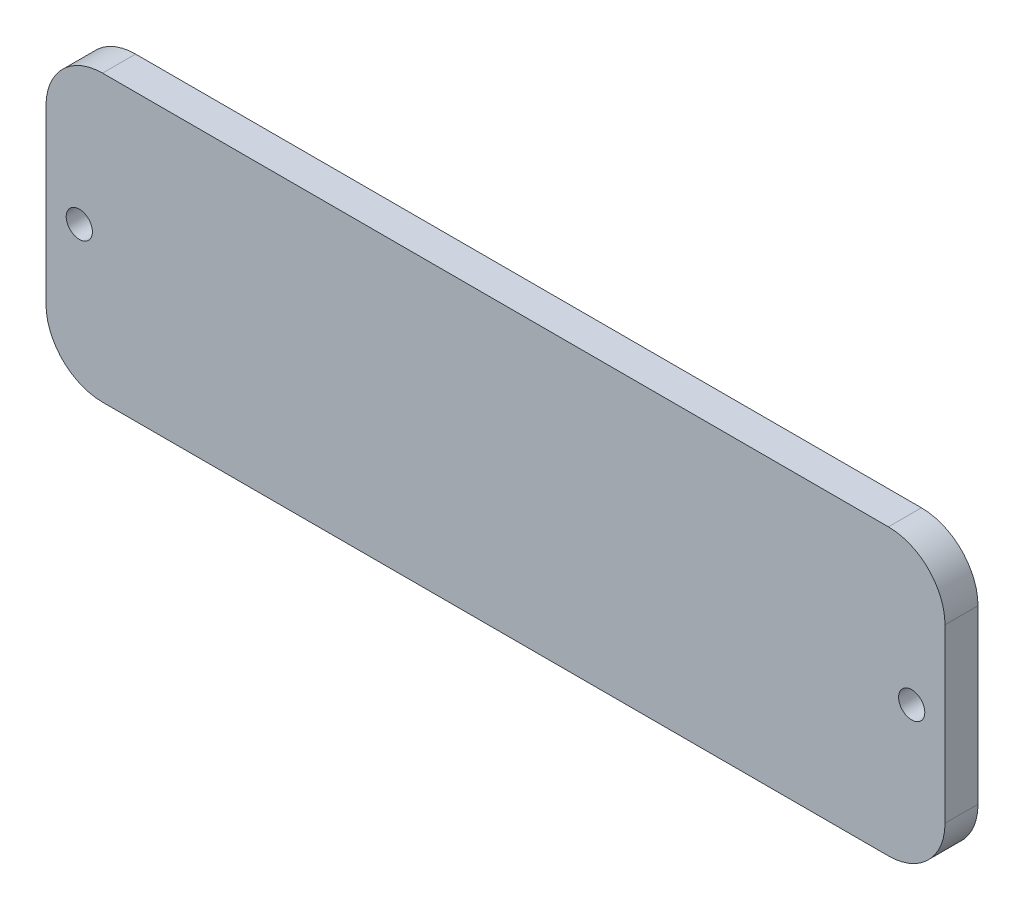
ISO-10303-21;
HEADER;
FILE_DESCRIPTION(('STEP AP214'),'2;1');
FILE_NAME('part.step','',(''),(''),'','','');
FILE_SCHEMA(('AUTOMOTIVE_DESIGN { 1 0 10303 214 1 1 1 1 }'));
ENDSEC;
DATA;
#1=APPLICATION_CONTEXT('core data for automotive mechanical design processes');
#2=APPLICATION_PROTOCOL_DEFINITION('international standard','automotive_design',2000,#1);
#3=PRODUCT_CONTEXT('',#1,'mechanical');
#4=PRODUCT('Part','Part','',(#3));
#5=PRODUCT_RELATED_PRODUCT_CATEGORY('part','',(#4));
#6=PRODUCT_DEFINITION_FORMATION('','',#4);
#7=PRODUCT_DEFINITION_CONTEXT('part definition',#1,'design');
#8=PRODUCT_DEFINITION('design','',#6,#7);
#9=PRODUCT_DEFINITION_SHAPE('','',#8);
#10=(LENGTH_UNIT() NAMED_UNIT(*) SI_UNIT(.MILLI.,.METRE.));
#11=(NAMED_UNIT(*) PLANE_ANGLE_UNIT() SI_UNIT($,.RADIAN.));
#12=(NAMED_UNIT(*) SI_UNIT($,.STERADIAN.) SOLID_ANGLE_UNIT());
#13=UNCERTAINTY_MEASURE_WITH_UNIT(LENGTH_MEASURE(1.E-05),#10,'distance_accuracy_value','');
#14=(GEOMETRIC_REPRESENTATION_CONTEXT(3) GLOBAL_UNCERTAINTY_ASSIGNED_CONTEXT((#13)) GLOBAL_UNIT_ASSIGNED_CONTEXT((#10,
#11,#12)) REPRESENTATION_CONTEXT('',''));
#15=CARTESIAN_POINT('',(0.,0.,0.));
#16=DIRECTION('',(0.,0.,1.));
#17=DIRECTION('',(1.,0.,0.));
#18=AXIS2_PLACEMENT_3D('',#15,#16,#17);
#19=CARTESIAN_POINT('',(-23.8125,5.207,-47.2125));
#20=DIRECTION('',(0.,0.,-1.));
#21=DIRECTION('',(-1.,0.,0.));
#22=AXIS2_PLACEMENT_3D('',#19,#20,#21);
#23=CYLINDRICAL_SURFACE('',#22,3.429);
#24=CARTESIAN_POINT('',(-23.8125,5.207,-49.2125));
#25=DIRECTION('',(0.,0.,-1.));
#26=DIRECTION('',(-1.,0.,0.));
#27=AXIS2_PLACEMENT_3D('',#24,#25,#26);
#28=CIRCLE('',#27,3.429);
#29=CARTESIAN_POINT('',(-27.2415,5.207,-49.2125));
#30=VERTEX_POINT('',#29);
#31=CARTESIAN_POINT('',(-23.8125,8.636,-49.2125));
#32=VERTEX_POINT('',#31);
#33=EDGE_CURVE('E129',#30,#32,#28,.T.);
#34=ORIENTED_EDGE('',*,*,#33,.F.);
#35=DIRECTION('',(0.,0.,-1.));
#36=VECTOR('',#35,1.);
#37=CARTESIAN_POINT('',(-27.2415,5.207,-47.2125));
#38=LINE('',#37,#36);
#39=CARTESIAN_POINT('',(-27.2415,5.207,-47.2125));
#40=VERTEX_POINT('',#39);
#41=EDGE_CURVE('E11',#40,#30,#38,.T.);
#42=ORIENTED_EDGE('',*,*,#41,.F.);
#43=CARTESIAN_POINT('',(-23.8125,5.207,-47.2125));
#44=DIRECTION('',(0.,0.,-1.));
#45=DIRECTION('',(-1.,0.,0.));
#46=AXIS2_PLACEMENT_3D('',#43,#44,#45);
#47=CIRCLE('',#46,3.429);
#48=CARTESIAN_POINT('',(-23.8125,8.636,-47.2125));
#49=VERTEX_POINT('',#48);
#50=EDGE_CURVE('E150',#40,#49,#47,.T.);
#51=ORIENTED_EDGE('',*,*,#50,.T.);
#52=DIRECTION('',(0.,0.,-1.));
#53=VECTOR('',#52,1.);
#54=CARTESIAN_POINT('',(-23.8125,8.636,-47.2125));
#55=LINE('',#54,#53);
#56=EDGE_CURVE('E35',#49,#32,#55,.T.);
#57=ORIENTED_EDGE('',*,*,#56,.T.);
#58=EDGE_LOOP('',(#34,#42,#51,#57));
#59=FACE_BOUND('',#58,.T.);
#60=ADVANCED_FACE('F32',(#59),#23,.T.);
#61=CARTESIAN_POINT('',(-27.2415,-5.207,-47.2125));
#62=DIRECTION('',(-1.,0.,0.));
#63=DIRECTION('',(0.,0.,1.));
#64=AXIS2_PLACEMENT_3D('',#61,#62,#63);
#65=PLANE('',#64);
#66=DIRECTION('',(0.,1.,0.));
#67=VECTOR('',#66,1.);
#68=CARTESIAN_POINT('',(-27.2415,-5.207,-49.2125));
#69=LINE('',#68,#67);
#70=CARTESIAN_POINT('',(-27.2415,-5.207,-49.2125));
#71=VERTEX_POINT('',#70);
#72=EDGE_CURVE('E148',#71,#30,#69,.T.);
#73=ORIENTED_EDGE('',*,*,#72,.F.);
#74=DIRECTION('',(0.,0.,-1.));
#75=VECTOR('',#74,1.);
#76=CARTESIAN_POINT('',(-27.2415,-5.207,-47.2125));
#77=LINE('',#76,#75);
#78=CARTESIAN_POINT('',(-27.2415,-5.207,-47.2125));
#79=VERTEX_POINT('',#78);
#80=EDGE_CURVE('E41',#79,#71,#77,.T.);
#81=ORIENTED_EDGE('',*,*,#80,.F.);
#82=DIRECTION('',(0.,1.,0.));
#83=VECTOR('',#82,1.);
#84=CARTESIAN_POINT('',(-27.2415,-5.207,-47.2125));
#85=LINE('',#84,#83);
#86=EDGE_CURVE('E119',#79,#40,#85,.T.);
#87=ORIENTED_EDGE('',*,*,#86,.T.);
#88=ORIENTED_EDGE('',*,*,#41,.T.);
#89=EDGE_LOOP('',(#73,#81,#87,#88));
#90=FACE_BOUND('',#89,.T.);
#91=ADVANCED_FACE('F162',(#90),#65,.T.);
#92=CARTESIAN_POINT('',(-23.8125,-5.207,-47.2125));
#93=DIRECTION('',(0.,0.,-1.));
#94=DIRECTION('',(-1.,0.,0.));
#95=AXIS2_PLACEMENT_3D('',#92,#93,#94);
#96=CYLINDRICAL_SURFACE('',#95,3.429);
#97=CARTESIAN_POINT('',(-23.8125,-5.207,-49.2125));
#98=DIRECTION('',(0.,0.,-1.));
#99=DIRECTION('',(-1.,0.,0.));
#100=AXIS2_PLACEMENT_3D('',#97,#98,#99);
#101=CIRCLE('',#100,3.429);
#102=CARTESIAN_POINT('',(-23.8125,-8.636,-49.2125));
#103=VERTEX_POINT('',#102);
#104=EDGE_CURVE('E106',#103,#71,#101,.T.);
#105=ORIENTED_EDGE('',*,*,#104,.F.);
#106=DIRECTION('',(0.,0.,-1.));
#107=VECTOR('',#106,1.);
#108=CARTESIAN_POINT('',(-23.8125,-8.636,-47.2125));
#109=LINE('',#108,#107);
#110=CARTESIAN_POINT('',(-23.8125,-8.636,-47.2125));
#111=VERTEX_POINT('',#110);
#112=EDGE_CURVE('E101',#111,#103,#109,.T.);
#113=ORIENTED_EDGE('',*,*,#112,.F.);
#114=CARTESIAN_POINT('',(-23.8125,-5.207,-47.2125));
#115=DIRECTION('',(0.,0.,-1.));
#116=DIRECTION('',(-1.,0.,0.));
#117=AXIS2_PLACEMENT_3D('',#114,#115,#116);
#118=CIRCLE('',#117,3.429);
#119=EDGE_CURVE('E104',#111,#79,#118,.T.);
#120=ORIENTED_EDGE('',*,*,#119,.T.);
#121=ORIENTED_EDGE('',*,*,#80,.T.);
#122=EDGE_LOOP('',(#105,#113,#120,#121));
#123=FACE_BOUND('',#122,.T.);
#124=ADVANCED_FACE('F103',(#123),#96,.T.);
#125=CARTESIAN_POINT('',(23.8125,-8.636,-47.2125));
#126=DIRECTION('',(0.,-1.,0.));
#127=DIRECTION('',(1.,0.,0.));
#128=AXIS2_PLACEMENT_3D('',#125,#126,#127);
#129=PLANE('',#128);
#130=DIRECTION('',(-1.,0.,0.));
#131=VECTOR('',#130,1.);
#132=CARTESIAN_POINT('',(23.8125,-8.636,-49.2125));
#133=LINE('',#132,#131);
#134=CARTESIAN_POINT('',(23.8125,-8.636,-49.2125));
#135=VERTEX_POINT('',#134);
#136=EDGE_CURVE('E145',#135,#103,#133,.T.);
#137=ORIENTED_EDGE('',*,*,#136,.F.);
#138=DIRECTION('',(0.,0.,-1.));
#139=VECTOR('',#138,1.);
#140=CARTESIAN_POINT('',(23.8125,-8.636,-47.2125));
#141=LINE('',#140,#139);
#142=CARTESIAN_POINT('',(23.8125,-8.636,-47.2125));
#143=VERTEX_POINT('',#142);
#144=EDGE_CURVE('E111',#143,#135,#141,.T.);
#145=ORIENTED_EDGE('',*,*,#144,.F.);
#146=DIRECTION('',(-1.,0.,0.));
#147=VECTOR('',#146,1.);
#148=CARTESIAN_POINT('',(23.8125,-8.636,-47.2125));
#149=LINE('',#148,#147);
#150=EDGE_CURVE('E117',#143,#111,#149,.T.);
#151=ORIENTED_EDGE('',*,*,#150,.T.);
#152=ORIENTED_EDGE('',*,*,#112,.T.);
#153=EDGE_LOOP('',(#137,#145,#151,#152));
#154=FACE_BOUND('',#153,.T.);
#155=ADVANCED_FACE('F121',(#154),#129,.T.);
#156=CARTESIAN_POINT('',(23.8125,-5.207,-47.2125));
#157=DIRECTION('',(0.,0.,-1.));
#158=DIRECTION('',(-1.,0.,0.));
#159=AXIS2_PLACEMENT_3D('',#156,#157,#158);
#160=CYLINDRICAL_SURFACE('',#159,3.429);
#161=CARTESIAN_POINT('',(23.8125,-5.207,-49.2125));
#162=DIRECTION('',(0.,0.,-1.));
#163=DIRECTION('',(-1.,0.,0.));
#164=AXIS2_PLACEMENT_3D('',#161,#162,#163);
#165=CIRCLE('',#164,3.429);
#166=CARTESIAN_POINT('',(27.2415,-5.207,-49.2125));
#167=VERTEX_POINT('',#166);
#168=EDGE_CURVE('E142',#167,#135,#165,.T.);
#169=ORIENTED_EDGE('',*,*,#168,.F.);
#170=DIRECTION('',(0.,0.,-1.));
#171=VECTOR('',#170,1.);
#172=CARTESIAN_POINT('',(27.2415,-5.207,-47.2125));
#173=LINE('',#172,#171);
#174=CARTESIAN_POINT('',(27.2415,-5.207,-47.2125));
#175=VERTEX_POINT('',#174);
#176=EDGE_CURVE('E154',#175,#167,#173,.T.);
#177=ORIENTED_EDGE('',*,*,#176,.F.);
#178=CARTESIAN_POINT('',(23.8125,-5.207,-47.2125));
#179=DIRECTION('',(0.,0.,-1.));
#180=DIRECTION('',(-1.,0.,0.));
#181=AXIS2_PLACEMENT_3D('',#178,#179,#180);
#182=CIRCLE('',#181,3.429);
#183=EDGE_CURVE('E122',#175,#143,#182,.T.);
#184=ORIENTED_EDGE('',*,*,#183,.T.);
#185=ORIENTED_EDGE('',*,*,#144,.T.);
#186=EDGE_LOOP('',(#169,#177,#184,#185));
#187=FACE_BOUND('',#186,.T.);
#188=ADVANCED_FACE('F175',(#187),#160,.T.);
#189=CARTESIAN_POINT('',(27.2415,5.207,-47.2125));
#190=DIRECTION('',(1.,0.,0.));
#191=DIRECTION('',(0.,0.,-1.));
#192=AXIS2_PLACEMENT_3D('',#189,#190,#191);
#193=PLANE('',#192);
#194=DIRECTION('',(0.,-1.,0.));
#195=VECTOR('',#194,1.);
#196=CARTESIAN_POINT('',(27.2415,5.207,-49.2125));
#197=LINE('',#196,#195);
#198=CARTESIAN_POINT('',(27.2415,5.207,-49.2125));
#199=VERTEX_POINT('',#198);
#200=EDGE_CURVE('E139',#199,#167,#197,.T.);
#201=ORIENTED_EDGE('',*,*,#200,.F.);
#202=DIRECTION('',(0.,0.,-1.));
#203=VECTOR('',#202,1.);
#204=CARTESIAN_POINT('',(27.2415,5.207,-47.2125));
#205=LINE('',#204,#203);
#206=CARTESIAN_POINT('',(27.2415,5.207,-47.2125));
#207=VERTEX_POINT('',#206);
#208=EDGE_CURVE('E156',#207,#199,#205,.T.);
#209=ORIENTED_EDGE('',*,*,#208,.F.);
#210=DIRECTION('',(0.,-1.,0.));
#211=VECTOR('',#210,1.);
#212=CARTESIAN_POINT('',(27.2415,5.207,-47.2125));
#213=LINE('',#212,#211);
#214=EDGE_CURVE('E124',#207,#175,#213,.T.);
#215=ORIENTED_EDGE('',*,*,#214,.T.);
#216=ORIENTED_EDGE('',*,*,#176,.T.);
#217=EDGE_LOOP('',(#201,#209,#215,#216));
#218=FACE_BOUND('',#217,.T.);
#219=ADVANCED_FACE('F178',(#218),#193,.T.);
#220=CARTESIAN_POINT('',(23.8125,5.207,-47.2125));
#221=DIRECTION('',(0.,0.,-1.));
#222=DIRECTION('',(-1.,0.,0.));
#223=AXIS2_PLACEMENT_3D('',#220,#221,#222);
#224=CYLINDRICAL_SURFACE('',#223,3.429);
#225=CARTESIAN_POINT('',(23.8125,5.207,-49.2125));
#226=DIRECTION('',(0.,0.,-1.));
#227=DIRECTION('',(-1.,0.,0.));
#228=AXIS2_PLACEMENT_3D('',#225,#226,#227);
#229=CIRCLE('',#228,3.429);
#230=CARTESIAN_POINT('',(23.8125,8.636,-49.2125));
#231=VERTEX_POINT('',#230);
#232=EDGE_CURVE('E136',#231,#199,#229,.T.);
#233=ORIENTED_EDGE('',*,*,#232,.F.);
#234=DIRECTION('',(0.,0.,-1.));
#235=VECTOR('',#234,1.);
#236=CARTESIAN_POINT('',(23.8125,8.636,-47.2125));
#237=LINE('',#236,#235);
#238=CARTESIAN_POINT('',(23.8125,8.636,-47.2125));
#239=VERTEX_POINT('',#238);
#240=EDGE_CURVE('E157',#239,#231,#237,.T.);
#241=ORIENTED_EDGE('',*,*,#240,.F.);
#242=CARTESIAN_POINT('',(23.8125,5.207,-47.2125));
#243=DIRECTION('',(0.,0.,-1.));
#244=DIRECTION('',(-1.,0.,0.));
#245=AXIS2_PLACEMENT_3D('',#242,#243,#244);
#246=CIRCLE('',#245,3.429);
#247=EDGE_CURVE('E224',#239,#207,#246,.T.);
#248=ORIENTED_EDGE('',*,*,#247,.T.);
#249=ORIENTED_EDGE('',*,*,#208,.T.);
#250=EDGE_LOOP('',(#233,#241,#248,#249));
#251=FACE_BOUND('',#250,.T.);
#252=ADVANCED_FACE('F182',(#251),#224,.T.);
#253=CARTESIAN_POINT('',(-23.8125,8.636,-47.2125));
#254=DIRECTION('',(0.,1.,0.));
#255=DIRECTION('',(0.,0.,1.));
#256=AXIS2_PLACEMENT_3D('',#253,#254,#255);
#257=PLANE('',#256);
#258=DIRECTION('',(1.,0.,0.));
#259=VECTOR('',#258,1.);
#260=CARTESIAN_POINT('',(-23.8125,8.636,-49.2125));
#261=LINE('',#260,#259);
#262=EDGE_CURVE('E132',#32,#231,#261,.T.);
#263=ORIENTED_EDGE('',*,*,#262,.F.);
#264=ORIENTED_EDGE('',*,*,#56,.F.);
#265=DIRECTION('',(1.,0.,0.));
#266=VECTOR('',#265,1.);
#267=CARTESIAN_POINT('',(-23.8125,8.636,-47.2125));
#268=LINE('',#267,#266);
#269=EDGE_CURVE('E222',#49,#239,#268,.T.);
#270=ORIENTED_EDGE('',*,*,#269,.T.);
#271=ORIENTED_EDGE('',*,*,#240,.T.);
#272=EDGE_LOOP('',(#263,#264,#270,#271));
#273=FACE_BOUND('',#272,.T.);
#274=ADVANCED_FACE('F159',(#273),#257,.T.);
#275=CARTESIAN_POINT('',(-23.8125,5.207,-47.2125));
#276=DIRECTION('',(0.,0.,-1.));
#277=DIRECTION('',(-1.,0.,0.));
#278=AXIS2_PLACEMENT_3D('',#275,#276,#277);
#279=PLANE('',#278);
#280=CARTESIAN_POINT('',(25.223,0.,-47.2125));
#281=DIRECTION('',(0.,0.,1.));
#282=DIRECTION('',(1.,0.,0.));
#283=AXIS2_PLACEMENT_3D('',#280,#281,#282);
#284=CIRCLE('',#283,0.793749999999989);
#285=CARTESIAN_POINT('',(26.01675,0.,-47.2125));
#286=VERTEX_POINT('',#285);
#287=EDGE_CURVE('E212',#286,#286,#284,.T.);
#288=ORIENTED_EDGE('',*,*,#287,.F.);
#289=EDGE_LOOP('',(#288));
#290=FACE_BOUND('',#289,.T.);
#291=CARTESIAN_POINT('',(-25.223,0.,-47.2125));
#292=DIRECTION('',(0.,0.,1.));
#293=DIRECTION('',(1.,0.,0.));
#294=AXIS2_PLACEMENT_3D('',#291,#292,#293);
#295=CIRCLE('',#294,0.793749999999989);
#296=CARTESIAN_POINT('',(-24.42925,0.,-47.2125));
#297=VERTEX_POINT('',#296);
#298=EDGE_CURVE('E214',#297,#297,#295,.T.);
#299=ORIENTED_EDGE('',*,*,#298,.F.);
#300=EDGE_LOOP('',(#299));
#301=FACE_BOUND('',#300,.T.);
#302=ORIENTED_EDGE('',*,*,#50,.F.);
#303=ORIENTED_EDGE('',*,*,#86,.F.);
#304=ORIENTED_EDGE('',*,*,#119,.F.);
#305=ORIENTED_EDGE('',*,*,#150,.F.);
#306=ORIENTED_EDGE('',*,*,#183,.F.);
#307=ORIENTED_EDGE('',*,*,#214,.F.);
#308=ORIENTED_EDGE('',*,*,#247,.F.);
#309=ORIENTED_EDGE('',*,*,#269,.F.);
#310=EDGE_LOOP('',(#302,#303,#304,#305,#306,#307,#308,#309));
#311=FACE_BOUND('',#310,.T.);
#312=ADVANCED_FACE('F115',(#290,#301,#311),#279,.F.);
#313=CARTESIAN_POINT('',(-23.8125,5.207,-49.2125));
#314=DIRECTION('',(0.,0.,-1.));
#315=DIRECTION('',(-1.,0.,0.));
#316=AXIS2_PLACEMENT_3D('',#313,#314,#315);
#317=PLANE('',#316);
#318=CARTESIAN_POINT('',(25.223,0.,-49.2125));
#319=DIRECTION('',(0.,0.,-1.));
#320=DIRECTION('',(-1.,0.,0.));
#321=AXIS2_PLACEMENT_3D('',#318,#319,#320);
#322=CIRCLE('',#321,0.793749999999987);
#323=CARTESIAN_POINT('',(24.42925,0.,-49.2125));
#324=VERTEX_POINT('',#323);
#325=EDGE_CURVE('E210',#324,#324,#322,.T.);
#326=ORIENTED_EDGE('',*,*,#325,.F.);
#327=EDGE_LOOP('',(#326));
#328=FACE_BOUND('',#327,.T.);
#329=CARTESIAN_POINT('',(-25.223,0.,-49.2125));
#330=DIRECTION('',(0.,0.,-1.));
#331=DIRECTION('',(-1.,0.,0.));
#332=AXIS2_PLACEMENT_3D('',#329,#330,#331);
#333=CIRCLE('',#332,0.793749999999987);
#334=CARTESIAN_POINT('',(-26.01675,0.,-49.2125));
#335=VERTEX_POINT('',#334);
#336=EDGE_CURVE('E133',#335,#335,#333,.T.);
#337=ORIENTED_EDGE('',*,*,#336,.F.);
#338=EDGE_LOOP('',(#337));
#339=FACE_BOUND('',#338,.T.);
#340=ORIENTED_EDGE('',*,*,#33,.T.);
#341=ORIENTED_EDGE('',*,*,#262,.T.);
#342=ORIENTED_EDGE('',*,*,#232,.T.);
#343=ORIENTED_EDGE('',*,*,#200,.T.);
#344=ORIENTED_EDGE('',*,*,#168,.T.);
#345=ORIENTED_EDGE('',*,*,#136,.T.);
#346=ORIENTED_EDGE('',*,*,#104,.T.);
#347=ORIENTED_EDGE('',*,*,#72,.T.);
#348=EDGE_LOOP('',(#340,#341,#342,#343,#344,#345,#346,#347));
#349=FACE_BOUND('',#348,.T.);
#350=ADVANCED_FACE('F161',(#328,#339,#349),#317,.T.);
#351=CARTESIAN_POINT('',(-25.223,0.,-47.2125));
#352=DIRECTION('',(0.,0.,1.));
#353=DIRECTION('',(1.,0.,0.));
#354=AXIS2_PLACEMENT_3D('',#351,#352,#353);
#355=CYLINDRICAL_SURFACE('',#354,0.793749999999987);
#356=ORIENTED_EDGE('',*,*,#336,.T.);
#357=EDGE_LOOP('',(#356));
#358=FACE_BOUND('',#357,.T.);
#359=ORIENTED_EDGE('',*,*,#298,.T.);
#360=EDGE_LOOP('',(#359));
#361=FACE_BOUND('',#360,.T.);
#362=ADVANCED_FACE('F194',(#358,#361),#355,.F.);
#363=CARTESIAN_POINT('',(25.223,0.,-47.2125));
#364=DIRECTION('',(0.,0.,1.));
#365=DIRECTION('',(1.,0.,0.));
#366=AXIS2_PLACEMENT_3D('',#363,#364,#365);
#367=CYLINDRICAL_SURFACE('',#366,0.793749999999987);
#368=ORIENTED_EDGE('',*,*,#325,.T.);
#369=EDGE_LOOP('',(#368));
#370=FACE_BOUND('',#369,.T.);
#371=ORIENTED_EDGE('',*,*,#287,.T.);
#372=EDGE_LOOP('',(#371));
#373=FACE_BOUND('',#372,.T.);
#374=ADVANCED_FACE('F201',(#370,#373),#367,.F.);
#375=CLOSED_SHELL('',(#60,#91,#124,#155,#188,#219,#252,#274,#312,#350,#362,#374));
#376=MANIFOLD_SOLID_BREP('B2',#375);
#377=ADVANCED_BREP_SHAPE_REPRESENTATION('',(#18,#376),#14);
#378=SHAPE_DEFINITION_REPRESENTATION(#9,#377);
ENDSEC;
END-ISO-10303-21;
